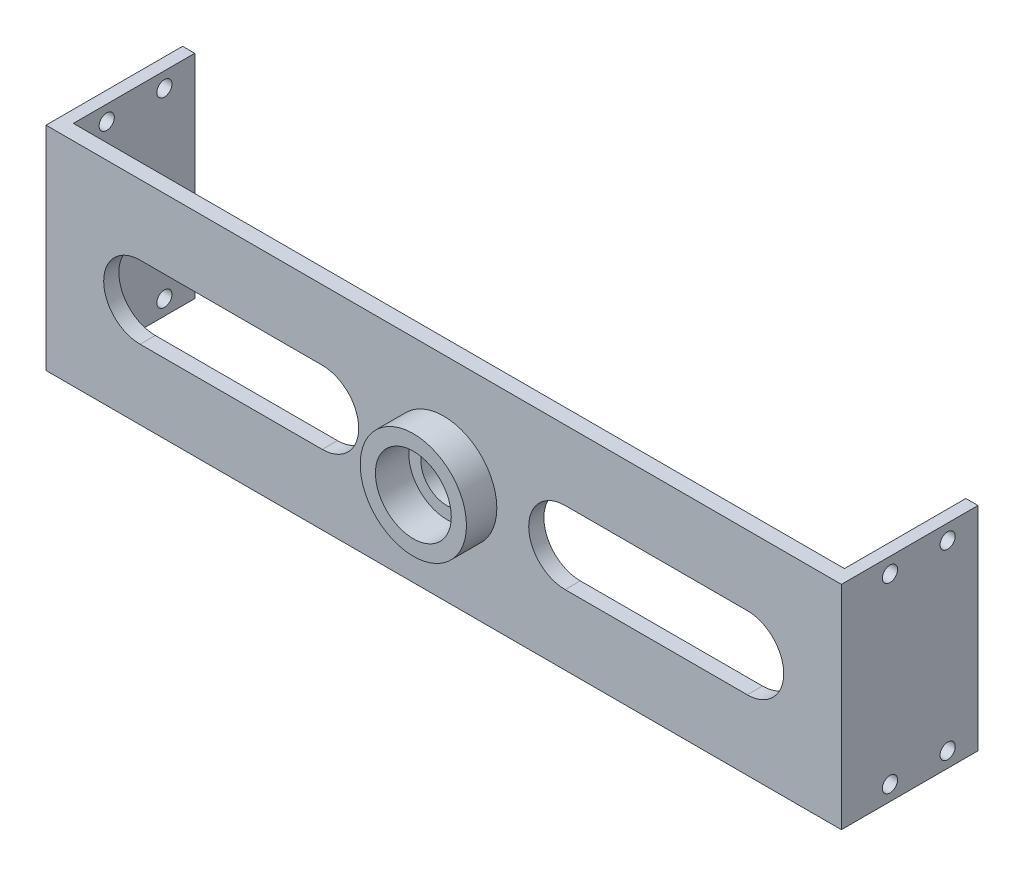
ISO-10303-21;
HEADER;
FILE_DESCRIPTION(('STEP AP214'),'2;1');
FILE_NAME('part.step','',(''),(''),'','','');
FILE_SCHEMA(('AUTOMOTIVE_DESIGN { 1 0 10303 214 1 1 1 1 }'));
ENDSEC;
DATA;
#1=APPLICATION_CONTEXT('core data for automotive mechanical design processes');
#2=APPLICATION_PROTOCOL_DEFINITION('international standard','automotive_design',2000,#1);
#3=PRODUCT_CONTEXT('',#1,'mechanical');
#4=PRODUCT('Part','Part','',(#3));
#5=PRODUCT_RELATED_PRODUCT_CATEGORY('part','',(#4));
#6=PRODUCT_DEFINITION_FORMATION('','',#4);
#7=PRODUCT_DEFINITION_CONTEXT('part definition',#1,'design');
#8=PRODUCT_DEFINITION('design','',#6,#7);
#9=PRODUCT_DEFINITION_SHAPE('','',#8);
#10=(LENGTH_UNIT() NAMED_UNIT(*) SI_UNIT(.MILLI.,.METRE.));
#11=(NAMED_UNIT(*) PLANE_ANGLE_UNIT() SI_UNIT($,.RADIAN.));
#12=(NAMED_UNIT(*) SI_UNIT($,.STERADIAN.) SOLID_ANGLE_UNIT());
#13=UNCERTAINTY_MEASURE_WITH_UNIT(LENGTH_MEASURE(1.E-05),#10,'distance_accuracy_value','');
#14=(GEOMETRIC_REPRESENTATION_CONTEXT(3) GLOBAL_UNCERTAINTY_ASSIGNED_CONTEXT((#13)) GLOBAL_UNIT_ASSIGNED_CONTEXT((#10,
#11,#12)) REPRESENTATION_CONTEXT('',''));
#15=CARTESIAN_POINT('',(0.,0.,0.));
#16=DIRECTION('',(0.,0.,1.));
#17=DIRECTION('',(1.,0.,0.));
#18=AXIS2_PLACEMENT_3D('',#15,#16,#17);
#19=CARTESIAN_POINT('',(0.,0.,0.));
#20=DIRECTION('',(0.,0.,1.));
#21=DIRECTION('',(1.,0.,0.));
#22=AXIS2_PLACEMENT_3D('',#19,#20,#21);
#23=CYLINDRICAL_SURFACE('',#22,12.5);
#24=CARTESIAN_POINT('',(0.,0.,15.));
#25=DIRECTION('',(0.,0.,1.));
#26=DIRECTION('',(1.,0.,0.));
#27=AXIS2_PLACEMENT_3D('',#24,#25,#26);
#28=CIRCLE('',#27,12.5);
#29=CARTESIAN_POINT('',(12.5,0.,15.));
#30=VERTEX_POINT('',#29);
#31=EDGE_CURVE('E259',#30,#30,#28,.T.);
#32=ORIENTED_EDGE('',*,*,#31,.T.);
#33=EDGE_LOOP('',(#32));
#34=FACE_BOUND('',#33,.T.);
#35=CARTESIAN_POINT('',(0.,0.,4.));
#36=DIRECTION('',(0.,0.,-1.));
#37=DIRECTION('',(-1.,0.,0.));
#38=AXIS2_PLACEMENT_3D('',#35,#36,#37);
#39=CIRCLE('',#38,12.5);
#40=CARTESIAN_POINT('',(-12.5,0.,4.));
#41=VERTEX_POINT('',#40);
#42=EDGE_CURVE('E11',#41,#41,#39,.F.);
#43=ORIENTED_EDGE('',*,*,#42,.F.);
#44=EDGE_LOOP('',(#43));
#45=FACE_BOUND('',#44,.T.);
#46=ADVANCED_FACE('F45',(#34,#45),#23,.F.);
#47=CARTESIAN_POINT('',(0.,0.,5.));
#48=DIRECTION('',(0.,0.,1.));
#49=DIRECTION('',(1.,0.,0.));
#50=AXIS2_PLACEMENT_3D('',#47,#48,#49);
#51=PLANE('',#50);
#52=CARTESIAN_POINT('',(-100.,0.,5.));
#53=DIRECTION('',(0.,0.,1.));
#54=DIRECTION('',(1.,0.,0.));
#55=AXIS2_PLACEMENT_3D('',#52,#53,#54);
#56=CIRCLE('',#55,12.);
#57=CARTESIAN_POINT('',(-100.,12.,5.));
#58=VERTEX_POINT('',#57);
#59=CARTESIAN_POINT('',(-100.,-12.,5.));
#60=VERTEX_POINT('',#59);
#61=EDGE_CURVE('E61',#58,#60,#56,.T.);
#62=ORIENTED_EDGE('',*,*,#61,.F.);
#63=DIRECTION('',(-1.,0.,0.));
#64=VECTOR('',#63,1.);
#65=CARTESIAN_POINT('',(-100.,12.,5.));
#66=LINE('',#65,#64);
#67=CARTESIAN_POINT('',(-40.,12.,5.));
#68=VERTEX_POINT('',#67);
#69=EDGE_CURVE('E230',#68,#58,#66,.T.);
#70=ORIENTED_EDGE('',*,*,#69,.F.);
#71=CARTESIAN_POINT('',(-40.,0.,5.));
#72=DIRECTION('',(0.,0.,1.));
#73=DIRECTION('',(1.,0.,0.));
#74=AXIS2_PLACEMENT_3D('',#71,#72,#73);
#75=CIRCLE('',#74,12.);
#76=CARTESIAN_POINT('',(-40.,-12.,5.));
#77=VERTEX_POINT('',#76);
#78=EDGE_CURVE('E249',#77,#68,#75,.T.);
#79=ORIENTED_EDGE('',*,*,#78,.F.);
#80=DIRECTION('',(1.,0.,0.));
#81=VECTOR('',#80,1.);
#82=CARTESIAN_POINT('',(-100.,-12.,5.));
#83=LINE('',#82,#81);
#84=EDGE_CURVE('E245',#60,#77,#83,.T.);
#85=ORIENTED_EDGE('',*,*,#84,.F.);
#86=EDGE_LOOP('',(#62,#70,#79,#85));
#87=FACE_BOUND('',#86,.T.);
#88=CARTESIAN_POINT('',(100.,0.,5.));
#89=DIRECTION('',(0.,0.,1.));
#90=DIRECTION('',(-1.,0.,0.));
#91=AXIS2_PLACEMENT_3D('',#88,#89,#90);
#92=CIRCLE('',#91,12.);
#93=CARTESIAN_POINT('',(100.,-12.,5.));
#94=VERTEX_POINT('',#93);
#95=CARTESIAN_POINT('',(100.,12.,5.));
#96=VERTEX_POINT('',#95);
#97=EDGE_CURVE('E69',#94,#96,#92,.T.);
#98=ORIENTED_EDGE('',*,*,#97,.F.);
#99=DIRECTION('',(1.,0.,0.));
#100=VECTOR('',#99,1.);
#101=CARTESIAN_POINT('',(100.,-12.,5.));
#102=LINE('',#101,#100);
#103=CARTESIAN_POINT('',(40.,-12.,5.));
#104=VERTEX_POINT('',#103);
#105=EDGE_CURVE('E280',#104,#94,#102,.T.);
#106=ORIENTED_EDGE('',*,*,#105,.F.);
#107=CARTESIAN_POINT('',(40.,0.,5.));
#108=DIRECTION('',(0.,0.,1.));
#109=DIRECTION('',(-1.,0.,0.));
#110=AXIS2_PLACEMENT_3D('',#107,#108,#109);
#111=CIRCLE('',#110,12.);
#112=CARTESIAN_POINT('',(40.,12.,5.));
#113=VERTEX_POINT('',#112);
#114=EDGE_CURVE('E284',#113,#104,#111,.T.);
#115=ORIENTED_EDGE('',*,*,#114,.F.);
#116=DIRECTION('',(-1.,0.,0.));
#117=VECTOR('',#116,1.);
#118=CARTESIAN_POINT('',(100.,12.,5.));
#119=LINE('',#118,#117);
#120=EDGE_CURVE('E289',#96,#113,#119,.T.);
#121=ORIENTED_EDGE('',*,*,#120,.F.);
#122=EDGE_LOOP('',(#98,#106,#115,#121));
#123=FACE_BOUND('',#122,.T.);
#124=DIRECTION('',(1.,0.,0.));
#125=VECTOR('',#124,1.);
#126=CARTESIAN_POINT('',(-127.,-35.,5.));
#127=LINE('',#126,#125);
#128=CARTESIAN_POINT('',(-131.,-35.,5.));
#129=VERTEX_POINT('',#128);
#130=CARTESIAN_POINT('',(131.,-35.,5.));
#131=VERTEX_POINT('',#130);
#132=EDGE_CURVE('E54',#129,#131,#127,.T.);
#133=ORIENTED_EDGE('',*,*,#132,.T.);
#134=DIRECTION('',(0.,-1.,0.));
#135=VECTOR('',#134,1.);
#136=CARTESIAN_POINT('',(131.,35.,5.));
#137=LINE('',#136,#135);
#138=CARTESIAN_POINT('',(131.,35.,5.));
#139=VERTEX_POINT('',#138);
#140=EDGE_CURVE('E177',#139,#131,#137,.T.);
#141=ORIENTED_EDGE('',*,*,#140,.F.);
#142=DIRECTION('',(-1.,0.,0.));
#143=VECTOR('',#142,1.);
#144=CARTESIAN_POINT('',(-127.,35.,5.));
#145=LINE('',#144,#143);
#146=CARTESIAN_POINT('',(-131.,35.,5.));
#147=VERTEX_POINT('',#146);
#148=EDGE_CURVE('E321',#139,#147,#145,.T.);
#149=ORIENTED_EDGE('',*,*,#148,.T.);
#150=DIRECTION('',(0.,1.,0.));
#151=VECTOR('',#150,1.);
#152=CARTESIAN_POINT('',(-131.,35.,5.));
#153=LINE('',#152,#151);
#154=EDGE_CURVE('E196',#129,#147,#153,.T.);
#155=ORIENTED_EDGE('',*,*,#154,.F.);
#156=EDGE_LOOP('',(#133,#141,#149,#155));
#157=FACE_BOUND('',#156,.T.);
#158=CARTESIAN_POINT('',(0.,0.,5.));
#159=DIRECTION('',(0.,0.,1.));
#160=DIRECTION('',(1.,0.,0.));
#161=AXIS2_PLACEMENT_3D('',#158,#159,#160);
#162=CIRCLE('',#161,17.5);
#163=CARTESIAN_POINT('',(17.5,0.,5.));
#164=VERTEX_POINT('',#163);
#165=EDGE_CURVE('E312',#164,#164,#162,.T.);
#166=ORIENTED_EDGE('',*,*,#165,.F.);
#167=EDGE_LOOP('',(#166));
#168=FACE_BOUND('',#167,.T.);
#169=ADVANCED_FACE('F456',(#87,#123,#157,#168),#51,.T.);
#170=CARTESIAN_POINT('',(-127.,35.,5.));
#171=DIRECTION('',(0.,-1.,0.));
#172=DIRECTION('',(0.,0.,-1.));
#173=AXIS2_PLACEMENT_3D('',#170,#171,#172);
#174=PLANE('',#173);
#175=DIRECTION('',(-1.,0.,0.));
#176=VECTOR('',#175,1.);
#177=CARTESIAN_POINT('',(-127.,35.,0.));
#178=LINE('',#177,#176);
#179=CARTESIAN_POINT('',(127.,35.,0.));
#180=VERTEX_POINT('',#179);
#181=CARTESIAN_POINT('',(-127.,35.,0.));
#182=VERTEX_POINT('',#181);
#183=EDGE_CURVE('E330',#180,#182,#178,.T.);
#184=ORIENTED_EDGE('',*,*,#183,.T.);
#185=DIRECTION('',(0.,0.,-1.));
#186=VECTOR('',#185,1.);
#187=CARTESIAN_POINT('',(-127.,35.,5.));
#188=LINE('',#187,#186);
#189=CARTESIAN_POINT('',(-127.,35.,-40.));
#190=VERTEX_POINT('',#189);
#191=EDGE_CURVE('E187',#182,#190,#188,.T.);
#192=ORIENTED_EDGE('',*,*,#191,.T.);
#193=DIRECTION('',(1.,0.,0.));
#194=VECTOR('',#193,1.);
#195=CARTESIAN_POINT('',(-131.,35.,-40.));
#196=LINE('',#195,#194);
#197=CARTESIAN_POINT('',(-131.,35.,-40.));
#198=VERTEX_POINT('',#197);
#199=EDGE_CURVE('E220',#198,#190,#196,.T.);
#200=ORIENTED_EDGE('',*,*,#199,.F.);
#201=DIRECTION('',(0.,0.,-1.));
#202=VECTOR('',#201,1.);
#203=CARTESIAN_POINT('',(-131.,35.,5.));
#204=LINE('',#203,#202);
#205=EDGE_CURVE('E200',#147,#198,#204,.T.);
#206=ORIENTED_EDGE('',*,*,#205,.F.);
#207=ORIENTED_EDGE('',*,*,#148,.F.);
#208=DIRECTION('',(0.,0.,1.));
#209=VECTOR('',#208,1.);
#210=CARTESIAN_POINT('',(131.,35.,-40.));
#211=LINE('',#210,#209);
#212=CARTESIAN_POINT('',(131.,35.,-40.));
#213=VERTEX_POINT('',#212);
#214=EDGE_CURVE('E170',#213,#139,#211,.T.);
#215=ORIENTED_EDGE('',*,*,#214,.F.);
#216=DIRECTION('',(-1.,0.,0.));
#217=VECTOR('',#216,1.);
#218=CARTESIAN_POINT('',(131.,35.,-40.));
#219=LINE('',#218,#217);
#220=CARTESIAN_POINT('',(127.,35.,-40.));
#221=VERTEX_POINT('',#220);
#222=EDGE_CURVE('E165',#213,#221,#219,.T.);
#223=ORIENTED_EDGE('',*,*,#222,.T.);
#224=DIRECTION('',(0.,0.,1.));
#225=VECTOR('',#224,1.);
#226=CARTESIAN_POINT('',(127.,35.,-40.));
#227=LINE('',#226,#225);
#228=EDGE_CURVE('E180',#221,#180,#227,.T.);
#229=ORIENTED_EDGE('',*,*,#228,.T.);
#230=EDGE_LOOP('',(#184,#192,#200,#206,#207,#215,#223,#229));
#231=FACE_BOUND('',#230,.T.);
#232=ADVANCED_FACE('F47',(#231),#174,.F.);
#233=CARTESIAN_POINT('',(-127.,-35.,5.));
#234=DIRECTION('',(0.,1.,0.));
#235=DIRECTION('',(0.,0.,1.));
#236=AXIS2_PLACEMENT_3D('',#233,#234,#235);
#237=PLANE('',#236);
#238=DIRECTION('',(1.,0.,0.));
#239=VECTOR('',#238,1.);
#240=CARTESIAN_POINT('',(-127.,-35.,0.));
#241=LINE('',#240,#239);
#242=CARTESIAN_POINT('',(-127.,-35.,0.));
#243=VERTEX_POINT('',#242);
#244=CARTESIAN_POINT('',(127.,-35.,0.));
#245=VERTEX_POINT('',#244);
#246=EDGE_CURVE('E324',#243,#245,#241,.T.);
#247=ORIENTED_EDGE('',*,*,#246,.T.);
#248=DIRECTION('',(0.,0.,-1.));
#249=VECTOR('',#248,1.);
#250=CARTESIAN_POINT('',(127.,-35.,5.));
#251=LINE('',#250,#249);
#252=CARTESIAN_POINT('',(127.,-35.,-40.));
#253=VERTEX_POINT('',#252);
#254=EDGE_CURVE('E184',#245,#253,#251,.T.);
#255=ORIENTED_EDGE('',*,*,#254,.T.);
#256=DIRECTION('',(-1.,0.,0.));
#257=VECTOR('',#256,1.);
#258=CARTESIAN_POINT('',(131.,-35.,-40.));
#259=LINE('',#258,#257);
#260=CARTESIAN_POINT('',(131.,-35.,-40.));
#261=VERTEX_POINT('',#260);
#262=EDGE_CURVE('E163',#261,#253,#259,.T.);
#263=ORIENTED_EDGE('',*,*,#262,.F.);
#264=DIRECTION('',(0.,0.,-1.));
#265=VECTOR('',#264,1.);
#266=CARTESIAN_POINT('',(131.,-35.,5.));
#267=LINE('',#266,#265);
#268=EDGE_CURVE('E171',#131,#261,#267,.T.);
#269=ORIENTED_EDGE('',*,*,#268,.F.);
#270=ORIENTED_EDGE('',*,*,#132,.F.);
#271=DIRECTION('',(0.,0.,1.));
#272=VECTOR('',#271,1.);
#273=CARTESIAN_POINT('',(-131.,-35.,5.));
#274=LINE('',#273,#272);
#275=CARTESIAN_POINT('',(-131.,-35.,-40.));
#276=VERTEX_POINT('',#275);
#277=EDGE_CURVE('E207',#276,#129,#274,.T.);
#278=ORIENTED_EDGE('',*,*,#277,.F.);
#279=DIRECTION('',(1.,0.,0.));
#280=VECTOR('',#279,1.);
#281=CARTESIAN_POINT('',(-131.,-35.,-40.));
#282=LINE('',#281,#280);
#283=CARTESIAN_POINT('',(-127.,-35.,-40.));
#284=VERTEX_POINT('',#283);
#285=EDGE_CURVE('E210',#276,#284,#282,.T.);
#286=ORIENTED_EDGE('',*,*,#285,.T.);
#287=DIRECTION('',(0.,0.,1.));
#288=VECTOR('',#287,1.);
#289=CARTESIAN_POINT('',(-127.,-35.,5.));
#290=LINE('',#289,#288);
#291=EDGE_CURVE('E201',#284,#243,#290,.T.);
#292=ORIENTED_EDGE('',*,*,#291,.T.);
#293=EDGE_LOOP('',(#247,#255,#263,#269,#270,#278,#286,#292));
#294=FACE_BOUND('',#293,.T.);
#295=ADVANCED_FACE('F182',(#294),#237,.F.);
#296=CARTESIAN_POINT('',(0.,0.,0.));
#297=DIRECTION('',(0.,0.,1.));
#298=DIRECTION('',(1.,0.,0.));
#299=AXIS2_PLACEMENT_3D('',#296,#297,#298);
#300=PLANE('',#299);
#301=DIRECTION('',(-1.,0.,0.));
#302=VECTOR('',#301,1.);
#303=CARTESIAN_POINT('',(-100.,12.,0.));
#304=LINE('',#303,#302);
#305=CARTESIAN_POINT('',(-40.,12.,0.));
#306=VERTEX_POINT('',#305);
#307=CARTESIAN_POINT('',(-100.,12.,0.));
#308=VERTEX_POINT('',#307);
#309=EDGE_CURVE('E238',#306,#308,#304,.T.);
#310=ORIENTED_EDGE('',*,*,#309,.T.);
#311=CARTESIAN_POINT('',(-100.,0.,0.));
#312=DIRECTION('',(0.,0.,1.));
#313=DIRECTION('',(1.,0.,0.));
#314=AXIS2_PLACEMENT_3D('',#311,#312,#313);
#315=CIRCLE('',#314,12.);
#316=CARTESIAN_POINT('',(-100.,-12.,0.));
#317=VERTEX_POINT('',#316);
#318=EDGE_CURVE('E225',#308,#317,#315,.T.);
#319=ORIENTED_EDGE('',*,*,#318,.T.);
#320=DIRECTION('',(1.,0.,0.));
#321=VECTOR('',#320,1.);
#322=CARTESIAN_POINT('',(-100.,-12.,0.));
#323=LINE('',#322,#321);
#324=CARTESIAN_POINT('',(-40.,-12.,0.));
#325=VERTEX_POINT('',#324);
#326=EDGE_CURVE('E229',#317,#325,#323,.T.);
#327=ORIENTED_EDGE('',*,*,#326,.T.);
#328=CARTESIAN_POINT('',(-40.,0.,0.));
#329=DIRECTION('',(0.,0.,1.));
#330=DIRECTION('',(1.,0.,0.));
#331=AXIS2_PLACEMENT_3D('',#328,#329,#330);
#332=CIRCLE('',#331,12.);
#333=EDGE_CURVE('E234',#325,#306,#332,.T.);
#334=ORIENTED_EDGE('',*,*,#333,.T.);
#335=EDGE_LOOP('',(#310,#319,#327,#334));
#336=FACE_BOUND('',#335,.T.);
#337=DIRECTION('',(1.,0.,0.));
#338=VECTOR('',#337,1.);
#339=CARTESIAN_POINT('',(100.,-12.,0.));
#340=LINE('',#339,#338);
#341=CARTESIAN_POINT('',(40.,-12.,0.));
#342=VERTEX_POINT('',#341);
#343=CARTESIAN_POINT('',(100.,-12.,0.));
#344=VERTEX_POINT('',#343);
#345=EDGE_CURVE('E271',#342,#344,#340,.T.);
#346=ORIENTED_EDGE('',*,*,#345,.T.);
#347=CARTESIAN_POINT('',(100.,0.,0.));
#348=DIRECTION('',(0.,0.,1.));
#349=DIRECTION('',(-1.,0.,0.));
#350=AXIS2_PLACEMENT_3D('',#347,#348,#349);
#351=CIRCLE('',#350,12.);
#352=CARTESIAN_POINT('',(100.,12.,0.));
#353=VERTEX_POINT('',#352);
#354=EDGE_CURVE('E285',#344,#353,#351,.T.);
#355=ORIENTED_EDGE('',*,*,#354,.T.);
#356=DIRECTION('',(-1.,0.,0.));
#357=VECTOR('',#356,1.);
#358=CARTESIAN_POINT('',(100.,12.,0.));
#359=LINE('',#358,#357);
#360=CARTESIAN_POINT('',(40.,12.,0.));
#361=VERTEX_POINT('',#360);
#362=EDGE_CURVE('E302',#353,#361,#359,.T.);
#363=ORIENTED_EDGE('',*,*,#362,.T.);
#364=CARTESIAN_POINT('',(40.,0.,0.));
#365=DIRECTION('',(0.,0.,1.));
#366=DIRECTION('',(-1.,0.,0.));
#367=AXIS2_PLACEMENT_3D('',#364,#365,#366);
#368=CIRCLE('',#367,12.);
#369=EDGE_CURVE('E298',#361,#342,#368,.T.);
#370=ORIENTED_EDGE('',*,*,#369,.T.);
#371=EDGE_LOOP('',(#346,#355,#363,#370));
#372=FACE_BOUND('',#371,.T.);
#373=DIRECTION('',(0.,1.,0.));
#374=VECTOR('',#373,1.);
#375=CARTESIAN_POINT('',(127.,35.,0.));
#376=LINE('',#375,#374);
#377=EDGE_CURVE('E317',#245,#180,#376,.T.);
#378=ORIENTED_EDGE('',*,*,#377,.F.);
#379=ORIENTED_EDGE('',*,*,#246,.F.);
#380=DIRECTION('',(0.,-1.,0.));
#381=VECTOR('',#380,1.);
#382=CARTESIAN_POINT('',(-127.,35.,0.));
#383=LINE('',#382,#381);
#384=EDGE_CURVE('E333',#182,#243,#383,.T.);
#385=ORIENTED_EDGE('',*,*,#384,.F.);
#386=ORIENTED_EDGE('',*,*,#183,.F.);
#387=EDGE_LOOP('',(#378,#379,#385,#386));
#388=FACE_BOUND('',#387,.T.);
#389=CARTESIAN_POINT('',(0.,0.,0.));
#390=DIRECTION('',(0.,0.,-1.));
#391=DIRECTION('',(-1.,0.,0.));
#392=AXIS2_PLACEMENT_3D('',#389,#390,#391);
#393=CIRCLE('',#392,8.5);
#394=CARTESIAN_POINT('',(-8.5,0.,0.));
#395=VERTEX_POINT('',#394);
#396=EDGE_CURVE('E425',#395,#395,#393,.T.);
#397=ORIENTED_EDGE('',*,*,#396,.F.);
#398=EDGE_LOOP('',(#397));
#399=FACE_BOUND('',#398,.T.);
#400=ADVANCED_FACE('F341',(#336,#372,#388,#399),#300,.F.);
#401=CARTESIAN_POINT('',(0.,0.,15.));
#402=DIRECTION('',(0.,0.,1.));
#403=DIRECTION('',(1.,0.,0.));
#404=AXIS2_PLACEMENT_3D('',#401,#402,#403);
#405=PLANE('',#404);
#406=CARTESIAN_POINT('',(0.,0.,15.));
#407=DIRECTION('',(0.,0.,1.));
#408=DIRECTION('',(1.,0.,0.));
#409=AXIS2_PLACEMENT_3D('',#406,#407,#408);
#410=CIRCLE('',#409,17.5);
#411=CARTESIAN_POINT('',(17.5,0.,15.));
#412=VERTEX_POINT('',#411);
#413=EDGE_CURVE('E313',#412,#412,#410,.T.);
#414=ORIENTED_EDGE('',*,*,#413,.T.);
#415=EDGE_LOOP('',(#414));
#416=FACE_BOUND('',#415,.T.);
#417=ORIENTED_EDGE('',*,*,#31,.F.);
#418=EDGE_LOOP('',(#417));
#419=FACE_BOUND('',#418,.T.);
#420=ADVANCED_FACE('F442',(#416,#419),#405,.T.);
#421=CARTESIAN_POINT('',(0.,0.,15.));
#422=DIRECTION('',(0.,0.,-1.));
#423=DIRECTION('',(-1.,0.,0.));
#424=AXIS2_PLACEMENT_3D('',#421,#422,#423);
#425=CYLINDRICAL_SURFACE('',#424,17.5);
#426=ORIENTED_EDGE('',*,*,#413,.F.);
#427=EDGE_LOOP('',(#426));
#428=FACE_BOUND('',#427,.T.);
#429=ORIENTED_EDGE('',*,*,#165,.T.);
#430=EDGE_LOOP('',(#429));
#431=FACE_BOUND('',#430,.T.);
#432=ADVANCED_FACE('F450',(#428,#431),#425,.T.);
#433=CARTESIAN_POINT('',(100.,0.,0.));
#434=DIRECTION('',(0.,0.,1.));
#435=DIRECTION('',(1.,0.,0.));
#436=AXIS2_PLACEMENT_3D('',#433,#434,#435);
#437=CYLINDRICAL_SURFACE('',#436,12.);
#438=ORIENTED_EDGE('',*,*,#97,.T.);
#439=DIRECTION('',(0.,0.,1.));
#440=VECTOR('',#439,1.);
#441=CARTESIAN_POINT('',(100.,12.,0.));
#442=LINE('',#441,#440);
#443=EDGE_CURVE('E268',#353,#96,#442,.T.);
#444=ORIENTED_EDGE('',*,*,#443,.F.);
#445=ORIENTED_EDGE('',*,*,#354,.F.);
#446=DIRECTION('',(0.,0.,1.));
#447=VECTOR('',#446,1.);
#448=CARTESIAN_POINT('',(100.,-12.,0.));
#449=LINE('',#448,#447);
#450=EDGE_CURVE('E224',#344,#94,#449,.T.);
#451=ORIENTED_EDGE('',*,*,#450,.T.);
#452=EDGE_LOOP('',(#438,#444,#445,#451));
#453=FACE_BOUND('',#452,.T.);
#454=ADVANCED_FACE('F467',(#453),#437,.F.);
#455=CARTESIAN_POINT('',(100.,-12.,0.));
#456=DIRECTION('',(0.,-1.,0.));
#457=DIRECTION('',(0.,0.,-1.));
#458=AXIS2_PLACEMENT_3D('',#455,#456,#457);
#459=PLANE('',#458);
#460=ORIENTED_EDGE('',*,*,#105,.T.);
#461=ORIENTED_EDGE('',*,*,#450,.F.);
#462=ORIENTED_EDGE('',*,*,#345,.F.);
#463=DIRECTION('',(0.,0.,1.));
#464=VECTOR('',#463,1.);
#465=CARTESIAN_POINT('',(40.,-12.,0.));
#466=LINE('',#465,#464);
#467=EDGE_CURVE('E275',#342,#104,#466,.T.);
#468=ORIENTED_EDGE('',*,*,#467,.T.);
#469=EDGE_LOOP('',(#460,#461,#462,#468));
#470=FACE_BOUND('',#469,.T.);
#471=ADVANCED_FACE('F470',(#470),#459,.F.);
#472=CARTESIAN_POINT('',(40.,0.,0.));
#473=DIRECTION('',(0.,0.,1.));
#474=DIRECTION('',(1.,0.,0.));
#475=AXIS2_PLACEMENT_3D('',#472,#473,#474);
#476=CYLINDRICAL_SURFACE('',#475,12.);
#477=ORIENTED_EDGE('',*,*,#114,.T.);
#478=ORIENTED_EDGE('',*,*,#467,.F.);
#479=ORIENTED_EDGE('',*,*,#369,.F.);
#480=DIRECTION('',(0.,0.,1.));
#481=VECTOR('',#480,1.);
#482=CARTESIAN_POINT('',(40.,12.,0.));
#483=LINE('',#482,#481);
#484=EDGE_CURVE('E272',#361,#113,#483,.T.);
#485=ORIENTED_EDGE('',*,*,#484,.T.);
#486=EDGE_LOOP('',(#477,#478,#479,#485));
#487=FACE_BOUND('',#486,.T.);
#488=ADVANCED_FACE('F473',(#487),#476,.F.);
#489=CARTESIAN_POINT('',(100.,12.,0.));
#490=DIRECTION('',(0.,1.,0.));
#491=DIRECTION('',(0.,0.,1.));
#492=AXIS2_PLACEMENT_3D('',#489,#490,#491);
#493=PLANE('',#492);
#494=ORIENTED_EDGE('',*,*,#120,.T.);
#495=ORIENTED_EDGE('',*,*,#484,.F.);
#496=ORIENTED_EDGE('',*,*,#362,.F.);
#497=ORIENTED_EDGE('',*,*,#443,.T.);
#498=EDGE_LOOP('',(#494,#495,#496,#497));
#499=FACE_BOUND('',#498,.T.);
#500=ADVANCED_FACE('F477',(#499),#493,.F.);
#501=CARTESIAN_POINT('',(-100.,0.,0.));
#502=DIRECTION('',(0.,0.,1.));
#503=DIRECTION('',(1.,0.,0.));
#504=AXIS2_PLACEMENT_3D('',#501,#502,#503);
#505=CYLINDRICAL_SURFACE('',#504,12.);
#506=ORIENTED_EDGE('',*,*,#61,.T.);
#507=DIRECTION('',(0.,0.,1.));
#508=VECTOR('',#507,1.);
#509=CARTESIAN_POINT('',(-100.,-12.,0.));
#510=LINE('',#509,#508);
#511=EDGE_CURVE('E242',#317,#60,#510,.T.);
#512=ORIENTED_EDGE('',*,*,#511,.F.);
#513=ORIENTED_EDGE('',*,*,#318,.F.);
#514=DIRECTION('',(0.,0.,1.));
#515=VECTOR('',#514,1.);
#516=CARTESIAN_POINT('',(-100.,12.,0.));
#517=LINE('',#516,#515);
#518=EDGE_CURVE('E256',#308,#58,#517,.T.);
#519=ORIENTED_EDGE('',*,*,#518,.T.);
#520=EDGE_LOOP('',(#506,#512,#513,#519));
#521=FACE_BOUND('',#520,.T.);
#522=ADVANCED_FACE('F481',(#521),#505,.F.);
#523=CARTESIAN_POINT('',(-100.,12.,0.));
#524=DIRECTION('',(0.,1.,0.));
#525=DIRECTION('',(0.,0.,1.));
#526=AXIS2_PLACEMENT_3D('',#523,#524,#525);
#527=PLANE('',#526);
#528=ORIENTED_EDGE('',*,*,#69,.T.);
#529=ORIENTED_EDGE('',*,*,#518,.F.);
#530=ORIENTED_EDGE('',*,*,#309,.F.);
#531=DIRECTION('',(0.,0.,1.));
#532=VECTOR('',#531,1.);
#533=CARTESIAN_POINT('',(-40.,12.,0.));
#534=LINE('',#533,#532);
#535=EDGE_CURVE('E260',#306,#68,#534,.T.);
#536=ORIENTED_EDGE('',*,*,#535,.T.);
#537=EDGE_LOOP('',(#528,#529,#530,#536));
#538=FACE_BOUND('',#537,.T.);
#539=ADVANCED_FACE('F487',(#538),#527,.F.);
#540=CARTESIAN_POINT('',(-40.,0.,0.));
#541=DIRECTION('',(0.,0.,1.));
#542=DIRECTION('',(1.,0.,0.));
#543=AXIS2_PLACEMENT_3D('',#540,#541,#542);
#544=CYLINDRICAL_SURFACE('',#543,12.);
#545=ORIENTED_EDGE('',*,*,#78,.T.);
#546=ORIENTED_EDGE('',*,*,#535,.F.);
#547=ORIENTED_EDGE('',*,*,#333,.F.);
#548=DIRECTION('',(0.,0.,1.));
#549=VECTOR('',#548,1.);
#550=CARTESIAN_POINT('',(-40.,-12.,0.));
#551=LINE('',#550,#549);
#552=EDGE_CURVE('E263',#325,#77,#551,.T.);
#553=ORIENTED_EDGE('',*,*,#552,.T.);
#554=EDGE_LOOP('',(#545,#546,#547,#553));
#555=FACE_BOUND('',#554,.T.);
#556=ADVANCED_FACE('F492',(#555),#544,.F.);
#557=CARTESIAN_POINT('',(-100.,-12.,0.));
#558=DIRECTION('',(0.,-1.,0.));
#559=DIRECTION('',(0.,0.,-1.));
#560=AXIS2_PLACEMENT_3D('',#557,#558,#559);
#561=PLANE('',#560);
#562=ORIENTED_EDGE('',*,*,#84,.T.);
#563=ORIENTED_EDGE('',*,*,#552,.F.);
#564=ORIENTED_EDGE('',*,*,#326,.F.);
#565=ORIENTED_EDGE('',*,*,#511,.T.);
#566=EDGE_LOOP('',(#562,#563,#564,#565));
#567=FACE_BOUND('',#566,.T.);
#568=ADVANCED_FACE('F488',(#567),#561,.F.);
#569=CARTESIAN_POINT('',(-131.,35.,-40.));
#570=DIRECTION('',(0.,0.,1.));
#571=DIRECTION('',(0.,-1.,0.));
#572=AXIS2_PLACEMENT_3D('',#569,#570,#571);
#573=PLANE('',#572);
#574=DIRECTION('',(0.,-1.,0.));
#575=VECTOR('',#574,1.);
#576=CARTESIAN_POINT('',(-127.,35.,-40.));
#577=LINE('',#576,#575);
#578=EDGE_CURVE('E191',#190,#284,#577,.T.);
#579=ORIENTED_EDGE('',*,*,#578,.T.);
#580=ORIENTED_EDGE('',*,*,#285,.F.);
#581=DIRECTION('',(0.,-1.,0.));
#582=VECTOR('',#581,1.);
#583=CARTESIAN_POINT('',(-131.,35.,-40.));
#584=LINE('',#583,#582);
#585=EDGE_CURVE('E204',#198,#276,#584,.T.);
#586=ORIENTED_EDGE('',*,*,#585,.F.);
#587=ORIENTED_EDGE('',*,*,#199,.T.);
#588=EDGE_LOOP('',(#579,#580,#586,#587));
#589=FACE_BOUND('',#588,.T.);
#590=ADVANCED_FACE('F491',(#589),#573,.F.);
#591=CARTESIAN_POINT('',(-131.,0.,0.));
#592=DIRECTION('',(1.,0.,0.));
#593=DIRECTION('',(0.,0.,-1.));
#594=AXIS2_PLACEMENT_3D('',#591,#592,#593);
#595=PLANE('',#594);
#596=CARTESIAN_POINT('',(-131.,-30.,-11.));
#597=DIRECTION('',(-1.,0.,0.));
#598=DIRECTION('',(0.,0.,1.));
#599=AXIS2_PLACEMENT_3D('',#596,#597,#598);
#600=CIRCLE('',#599,2.5);
#601=CARTESIAN_POINT('',(-131.,-30.,-8.5));
#602=VERTEX_POINT('',#601);
#603=EDGE_CURVE('E397',#602,#602,#600,.T.);
#604=ORIENTED_EDGE('',*,*,#603,.F.);
#605=EDGE_LOOP('',(#604));
#606=FACE_BOUND('',#605,.T.);
#607=CARTESIAN_POINT('',(-131.,30.,-30.));
#608=DIRECTION('',(-1.,0.,0.));
#609=DIRECTION('',(0.,0.,1.));
#610=AXIS2_PLACEMENT_3D('',#607,#608,#609);
#611=CIRCLE('',#610,2.5);
#612=CARTESIAN_POINT('',(-131.,30.,-27.5));
#613=VERTEX_POINT('',#612);
#614=EDGE_CURVE('E405',#613,#613,#611,.T.);
#615=ORIENTED_EDGE('',*,*,#614,.F.);
#616=EDGE_LOOP('',(#615));
#617=FACE_BOUND('',#616,.T.);
#618=CARTESIAN_POINT('',(-131.,-30.,-30.));
#619=DIRECTION('',(-1.,0.,0.));
#620=DIRECTION('',(0.,0.,1.));
#621=AXIS2_PLACEMENT_3D('',#618,#619,#620);
#622=CIRCLE('',#621,2.5);
#623=CARTESIAN_POINT('',(-131.,-30.,-27.5));
#624=VERTEX_POINT('',#623);
#625=EDGE_CURVE('E406',#624,#624,#622,.T.);
#626=ORIENTED_EDGE('',*,*,#625,.F.);
#627=EDGE_LOOP('',(#626));
#628=FACE_BOUND('',#627,.T.);
#629=CARTESIAN_POINT('',(-131.,30.,-11.));
#630=DIRECTION('',(-1.,0.,0.));
#631=DIRECTION('',(0.,0.,1.));
#632=AXIS2_PLACEMENT_3D('',#629,#630,#631);
#633=CIRCLE('',#632,2.5);
#634=CARTESIAN_POINT('',(-131.,30.,-8.5));
#635=VERTEX_POINT('',#634);
#636=EDGE_CURVE('E393',#635,#635,#633,.T.);
#637=ORIENTED_EDGE('',*,*,#636,.F.);
#638=EDGE_LOOP('',(#637));
#639=FACE_BOUND('',#638,.T.);
#640=ORIENTED_EDGE('',*,*,#154,.T.);
#641=ORIENTED_EDGE('',*,*,#205,.T.);
#642=ORIENTED_EDGE('',*,*,#585,.T.);
#643=ORIENTED_EDGE('',*,*,#277,.T.);
#644=EDGE_LOOP('',(#640,#641,#642,#643));
#645=FACE_BOUND('',#644,.T.);
#646=ADVANCED_FACE('F502',(#606,#617,#628,#639,#645),#595,.F.);
#647=CARTESIAN_POINT('',(-127.,0.,0.));
#648=DIRECTION('',(1.,0.,0.));
#649=DIRECTION('',(0.,0.,-1.));
#650=AXIS2_PLACEMENT_3D('',#647,#648,#649);
#651=PLANE('',#650);
#652=CARTESIAN_POINT('',(-127.,-30.,-11.));
#653=DIRECTION('',(1.,0.,0.));
#654=DIRECTION('',(0.,0.,-1.));
#655=AXIS2_PLACEMENT_3D('',#652,#653,#654);
#656=CIRCLE('',#655,2.5);
#657=CARTESIAN_POINT('',(-127.,-30.,-13.5));
#658=VERTEX_POINT('',#657);
#659=EDGE_CURVE('E349',#658,#658,#656,.T.);
#660=ORIENTED_EDGE('',*,*,#659,.F.);
#661=EDGE_LOOP('',(#660));
#662=FACE_BOUND('',#661,.T.);
#663=CARTESIAN_POINT('',(-127.,30.,-30.));
#664=DIRECTION('',(1.,0.,0.));
#665=DIRECTION('',(0.,0.,-1.));
#666=AXIS2_PLACEMENT_3D('',#663,#664,#665);
#667=CIRCLE('',#666,2.5);
#668=CARTESIAN_POINT('',(-127.,30.,-32.5));
#669=VERTEX_POINT('',#668);
#670=EDGE_CURVE('E368',#669,#669,#667,.T.);
#671=ORIENTED_EDGE('',*,*,#670,.F.);
#672=EDGE_LOOP('',(#671));
#673=FACE_BOUND('',#672,.T.);
#674=CARTESIAN_POINT('',(-127.,-30.,-30.));
#675=DIRECTION('',(1.,0.,0.));
#676=DIRECTION('',(0.,0.,-1.));
#677=AXIS2_PLACEMENT_3D('',#674,#675,#676);
#678=CIRCLE('',#677,2.5);
#679=CARTESIAN_POINT('',(-127.,-30.,-32.5));
#680=VERTEX_POINT('',#679);
#681=EDGE_CURVE('E376',#680,#680,#678,.T.);
#682=ORIENTED_EDGE('',*,*,#681,.F.);
#683=EDGE_LOOP('',(#682));
#684=FACE_BOUND('',#683,.T.);
#685=CARTESIAN_POINT('',(-127.,30.,-11.));
#686=DIRECTION('',(1.,0.,0.));
#687=DIRECTION('',(0.,0.,-1.));
#688=AXIS2_PLACEMENT_3D('',#685,#686,#687);
#689=CIRCLE('',#688,2.5);
#690=CARTESIAN_POINT('',(-127.,30.,-13.5));
#691=VERTEX_POINT('',#690);
#692=EDGE_CURVE('E384',#691,#691,#689,.T.);
#693=ORIENTED_EDGE('',*,*,#692,.F.);
#694=EDGE_LOOP('',(#693));
#695=FACE_BOUND('',#694,.T.);
#696=ORIENTED_EDGE('',*,*,#191,.F.);
#697=ORIENTED_EDGE('',*,*,#384,.T.);
#698=ORIENTED_EDGE('',*,*,#291,.F.);
#699=ORIENTED_EDGE('',*,*,#578,.F.);
#700=EDGE_LOOP('',(#696,#697,#698,#699));
#701=FACE_BOUND('',#700,.T.);
#702=ADVANCED_FACE('F504',(#662,#673,#684,#695,#701),#651,.T.);
#703=CARTESIAN_POINT('',(127.,0.,0.));
#704=DIRECTION('',(1.,0.,0.));
#705=DIRECTION('',(0.,0.,-1.));
#706=AXIS2_PLACEMENT_3D('',#703,#704,#705);
#707=PLANE('',#706);
#708=CARTESIAN_POINT('',(127.,-30.,-11.));
#709=DIRECTION('',(1.,0.,0.));
#710=DIRECTION('',(0.,0.,-1.));
#711=AXIS2_PLACEMENT_3D('',#708,#709,#710);
#712=CIRCLE('',#711,2.5);
#713=CARTESIAN_POINT('',(127.,-30.,-13.5));
#714=VERTEX_POINT('',#713);
#715=EDGE_CURVE('E355',#714,#714,#712,.T.);
#716=ORIENTED_EDGE('',*,*,#715,.T.);
#717=EDGE_LOOP('',(#716));
#718=FACE_BOUND('',#717,.T.);
#719=CARTESIAN_POINT('',(127.,30.,-30.));
#720=DIRECTION('',(1.,0.,0.));
#721=DIRECTION('',(0.,0.,-1.));
#722=AXIS2_PLACEMENT_3D('',#719,#720,#721);
#723=CIRCLE('',#722,2.5);
#724=CARTESIAN_POINT('',(127.,30.,-32.5));
#725=VERTEX_POINT('',#724);
#726=EDGE_CURVE('E372',#725,#725,#723,.T.);
#727=ORIENTED_EDGE('',*,*,#726,.T.);
#728=EDGE_LOOP('',(#727));
#729=FACE_BOUND('',#728,.T.);
#730=CARTESIAN_POINT('',(127.,-30.,-30.));
#731=DIRECTION('',(1.,0.,0.));
#732=DIRECTION('',(0.,0.,-1.));
#733=AXIS2_PLACEMENT_3D('',#730,#731,#732);
#734=CIRCLE('',#733,2.5);
#735=CARTESIAN_POINT('',(127.,-30.,-32.5));
#736=VERTEX_POINT('',#735);
#737=EDGE_CURVE('E380',#736,#736,#734,.T.);
#738=ORIENTED_EDGE('',*,*,#737,.T.);
#739=EDGE_LOOP('',(#738));
#740=FACE_BOUND('',#739,.T.);
#741=CARTESIAN_POINT('',(127.,30.,-11.));
#742=DIRECTION('',(1.,0.,0.));
#743=DIRECTION('',(0.,0.,-1.));
#744=AXIS2_PLACEMENT_3D('',#741,#742,#743);
#745=CIRCLE('',#744,2.5);
#746=CARTESIAN_POINT('',(127.,30.,-13.5));
#747=VERTEX_POINT('',#746);
#748=EDGE_CURVE('E388',#747,#747,#745,.T.);
#749=ORIENTED_EDGE('',*,*,#748,.T.);
#750=EDGE_LOOP('',(#749));
#751=FACE_BOUND('',#750,.T.);
#752=ORIENTED_EDGE('',*,*,#254,.F.);
#753=ORIENTED_EDGE('',*,*,#377,.T.);
#754=ORIENTED_EDGE('',*,*,#228,.F.);
#755=DIRECTION('',(0.,1.,0.));
#756=VECTOR('',#755,1.);
#757=CARTESIAN_POINT('',(127.,-35.,-40.));
#758=LINE('',#757,#756);
#759=EDGE_CURVE('E347',#253,#221,#758,.T.);
#760=ORIENTED_EDGE('',*,*,#759,.F.);
#761=EDGE_LOOP('',(#752,#753,#754,#760));
#762=FACE_BOUND('',#761,.T.);
#763=ADVANCED_FACE('F346',(#718,#729,#740,#751,#762),#707,.F.);
#764=CARTESIAN_POINT('',(131.,-35.,-40.));
#765=DIRECTION('',(0.,0.,1.));
#766=DIRECTION('',(0.,-1.,0.));
#767=AXIS2_PLACEMENT_3D('',#764,#765,#766);
#768=PLANE('',#767);
#769=ORIENTED_EDGE('',*,*,#759,.T.);
#770=ORIENTED_EDGE('',*,*,#222,.F.);
#771=DIRECTION('',(0.,1.,0.));
#772=VECTOR('',#771,1.);
#773=CARTESIAN_POINT('',(131.,-35.,-40.));
#774=LINE('',#773,#772);
#775=EDGE_CURVE('E159',#261,#213,#774,.T.);
#776=ORIENTED_EDGE('',*,*,#775,.F.);
#777=ORIENTED_EDGE('',*,*,#262,.T.);
#778=EDGE_LOOP('',(#769,#770,#776,#777));
#779=FACE_BOUND('',#778,.T.);
#780=ADVANCED_FACE('F161',(#779),#768,.F.);
#781=CARTESIAN_POINT('',(131.,0.,0.));
#782=DIRECTION('',(1.,0.,0.));
#783=DIRECTION('',(0.,0.,-1.));
#784=AXIS2_PLACEMENT_3D('',#781,#782,#783);
#785=PLANE('',#784);
#786=CARTESIAN_POINT('',(131.,-30.,-11.));
#787=DIRECTION('',(-1.,0.,0.));
#788=DIRECTION('',(0.,0.,1.));
#789=AXIS2_PLACEMENT_3D('',#786,#787,#788);
#790=CIRCLE('',#789,2.5);
#791=CARTESIAN_POINT('',(131.,-30.,-8.5));
#792=VERTEX_POINT('',#791);
#793=EDGE_CURVE('E410',#792,#792,#790,.T.);
#794=ORIENTED_EDGE('',*,*,#793,.T.);
#795=EDGE_LOOP('',(#794));
#796=FACE_BOUND('',#795,.T.);
#797=CARTESIAN_POINT('',(131.,30.,-30.));
#798=DIRECTION('',(-1.,0.,0.));
#799=DIRECTION('',(0.,0.,1.));
#800=AXIS2_PLACEMENT_3D('',#797,#798,#799);
#801=CIRCLE('',#800,2.5);
#802=CARTESIAN_POINT('',(131.,30.,-27.5));
#803=VERTEX_POINT('',#802);
#804=EDGE_CURVE('E401',#803,#803,#801,.T.);
#805=ORIENTED_EDGE('',*,*,#804,.T.);
#806=EDGE_LOOP('',(#805));
#807=FACE_BOUND('',#806,.T.);
#808=CARTESIAN_POINT('',(131.,-30.,-30.));
#809=DIRECTION('',(-1.,0.,0.));
#810=DIRECTION('',(0.,0.,1.));
#811=AXIS2_PLACEMENT_3D('',#808,#809,#810);
#812=CIRCLE('',#811,2.5);
#813=CARTESIAN_POINT('',(131.,-30.,-27.5));
#814=VERTEX_POINT('',#813);
#815=EDGE_CURVE('E417',#814,#814,#812,.T.);
#816=ORIENTED_EDGE('',*,*,#815,.T.);
#817=EDGE_LOOP('',(#816));
#818=FACE_BOUND('',#817,.T.);
#819=CARTESIAN_POINT('',(131.,30.,-11.));
#820=DIRECTION('',(-1.,0.,0.));
#821=DIRECTION('',(0.,0.,1.));
#822=AXIS2_PLACEMENT_3D('',#819,#820,#821);
#823=CIRCLE('',#822,2.5);
#824=CARTESIAN_POINT('',(131.,30.,-8.5));
#825=VERTEX_POINT('',#824);
#826=EDGE_CURVE('E392',#825,#825,#823,.T.);
#827=ORIENTED_EDGE('',*,*,#826,.T.);
#828=EDGE_LOOP('',(#827));
#829=FACE_BOUND('',#828,.T.);
#830=ORIENTED_EDGE('',*,*,#268,.T.);
#831=ORIENTED_EDGE('',*,*,#775,.T.);
#832=ORIENTED_EDGE('',*,*,#214,.T.);
#833=ORIENTED_EDGE('',*,*,#140,.T.);
#834=EDGE_LOOP('',(#830,#831,#832,#833));
#835=FACE_BOUND('',#834,.T.);
#836=ADVANCED_FACE('F175',(#796,#807,#818,#829,#835),#785,.T.);
#837=CARTESIAN_POINT('',(131.,30.,-11.));
#838=DIRECTION('',(-1.,0.,0.));
#839=DIRECTION('',(0.,0.,1.));
#840=AXIS2_PLACEMENT_3D('',#837,#838,#839);
#841=CYLINDRICAL_SURFACE('',#840,2.5);
#842=ORIENTED_EDGE('',*,*,#826,.F.);
#843=EDGE_LOOP('',(#842));
#844=FACE_BOUND('',#843,.T.);
#845=ORIENTED_EDGE('',*,*,#748,.F.);
#846=EDGE_LOOP('',(#845));
#847=FACE_BOUND('',#846,.T.);
#848=ADVANCED_FACE('F518',(#844,#847),#841,.F.);
#849=CARTESIAN_POINT('',(131.,-30.,-30.));
#850=DIRECTION('',(-1.,0.,0.));
#851=DIRECTION('',(0.,0.,1.));
#852=AXIS2_PLACEMENT_3D('',#849,#850,#851);
#853=CYLINDRICAL_SURFACE('',#852,2.5);
#854=ORIENTED_EDGE('',*,*,#815,.F.);
#855=EDGE_LOOP('',(#854));
#856=FACE_BOUND('',#855,.T.);
#857=ORIENTED_EDGE('',*,*,#737,.F.);
#858=EDGE_LOOP('',(#857));
#859=FACE_BOUND('',#858,.T.);
#860=ADVANCED_FACE('F537',(#856,#859),#853,.F.);
#861=CARTESIAN_POINT('',(131.,30.,-30.));
#862=DIRECTION('',(-1.,0.,0.));
#863=DIRECTION('',(0.,0.,1.));
#864=AXIS2_PLACEMENT_3D('',#861,#862,#863);
#865=CYLINDRICAL_SURFACE('',#864,2.5);
#866=ORIENTED_EDGE('',*,*,#804,.F.);
#867=EDGE_LOOP('',(#866));
#868=FACE_BOUND('',#867,.T.);
#869=ORIENTED_EDGE('',*,*,#726,.F.);
#870=EDGE_LOOP('',(#869));
#871=FACE_BOUND('',#870,.T.);
#872=ADVANCED_FACE('F531',(#868,#871),#865,.F.);
#873=CARTESIAN_POINT('',(131.,-30.,-11.));
#874=DIRECTION('',(-1.,0.,0.));
#875=DIRECTION('',(0.,0.,1.));
#876=AXIS2_PLACEMENT_3D('',#873,#874,#875);
#877=CYLINDRICAL_SURFACE('',#876,2.5);
#878=ORIENTED_EDGE('',*,*,#793,.F.);
#879=EDGE_LOOP('',(#878));
#880=FACE_BOUND('',#879,.T.);
#881=ORIENTED_EDGE('',*,*,#715,.F.);
#882=EDGE_LOOP('',(#881));
#883=FACE_BOUND('',#882,.T.);
#884=ADVANCED_FACE('F524',(#880,#883),#877,.F.);
#885=ORIENTED_EDGE('',*,*,#692,.T.);
#886=EDGE_LOOP('',(#885));
#887=FACE_BOUND('',#886,.T.);
#888=ORIENTED_EDGE('',*,*,#636,.T.);
#889=EDGE_LOOP('',(#888));
#890=FACE_BOUND('',#889,.T.);
#891=ADVANCED_FACE('F520',(#887,#890),#841,.F.);
#892=ORIENTED_EDGE('',*,*,#681,.T.);
#893=EDGE_LOOP('',(#892));
#894=FACE_BOUND('',#893,.T.);
#895=ORIENTED_EDGE('',*,*,#625,.T.);
#896=EDGE_LOOP('',(#895));
#897=FACE_BOUND('',#896,.T.);
#898=ADVANCED_FACE('F523',(#894,#897),#853,.F.);
#899=ORIENTED_EDGE('',*,*,#670,.T.);
#900=EDGE_LOOP('',(#899));
#901=FACE_BOUND('',#900,.T.);
#902=ORIENTED_EDGE('',*,*,#614,.T.);
#903=EDGE_LOOP('',(#902));
#904=FACE_BOUND('',#903,.T.);
#905=ADVANCED_FACE('F526',(#901,#904),#865,.F.);
#906=ORIENTED_EDGE('',*,*,#659,.T.);
#907=EDGE_LOOP('',(#906));
#908=FACE_BOUND('',#907,.T.);
#909=ORIENTED_EDGE('',*,*,#603,.T.);
#910=EDGE_LOOP('',(#909));
#911=FACE_BOUND('',#910,.T.);
#912=ADVANCED_FACE('F529',(#908,#911),#877,.F.);
#913=CARTESIAN_POINT('',(0.,0.,4.));
#914=DIRECTION('',(0.,0.,-1.));
#915=DIRECTION('',(-1.,0.,0.));
#916=AXIS2_PLACEMENT_3D('',#913,#914,#915);
#917=PLANE('',#916);
#918=CARTESIAN_POINT('',(0.,0.,4.));
#919=DIRECTION('',(0.,0.,-1.));
#920=DIRECTION('',(-1.,0.,0.));
#921=AXIS2_PLACEMENT_3D('',#918,#919,#920);
#922=CIRCLE('',#921,8.5);
#923=CARTESIAN_POINT('',(-8.5,0.,4.));
#924=VERTEX_POINT('',#923);
#925=EDGE_CURVE('E421',#924,#924,#922,.T.);
#926=ORIENTED_EDGE('',*,*,#925,.T.);
#927=EDGE_LOOP('',(#926));
#928=FACE_BOUND('',#927,.T.);
#929=ORIENTED_EDGE('',*,*,#42,.T.);
#930=EDGE_LOOP('',(#929));
#931=FACE_BOUND('',#930,.T.);
#932=ADVANCED_FACE('F433',(#928,#931),#917,.F.);
#933=CARTESIAN_POINT('',(0.,0.,4.));
#934=DIRECTION('',(0.,0.,-1.));
#935=DIRECTION('',(-1.,0.,0.));
#936=AXIS2_PLACEMENT_3D('',#933,#934,#935);
#937=CYLINDRICAL_SURFACE('',#936,8.5);
#938=ORIENTED_EDGE('',*,*,#925,.F.);
#939=EDGE_LOOP('',(#938));
#940=FACE_BOUND('',#939,.T.);
#941=ORIENTED_EDGE('',*,*,#396,.T.);
#942=EDGE_LOOP('',(#941));
#943=FACE_BOUND('',#942,.T.);
#944=ADVANCED_FACE('F436',(#940,#943),#937,.F.);
#945=CLOSED_SHELL('',(#46,#169,#232,#295,#400,#420,#432,#454,#471,#488,#500,#522,#539,#556,#568,
#590,#646,#702,#763,#780,#836,#848,#860,#872,#884,#891,#898,#905,#912,#932,#944));
#946=MANIFOLD_SOLID_BREP('B2',#945);
#947=ADVANCED_BREP_SHAPE_REPRESENTATION('',(#18,#946),#14);
#948=SHAPE_DEFINITION_REPRESENTATION(#9,#947);
ENDSEC;
END-ISO-10303-21;
